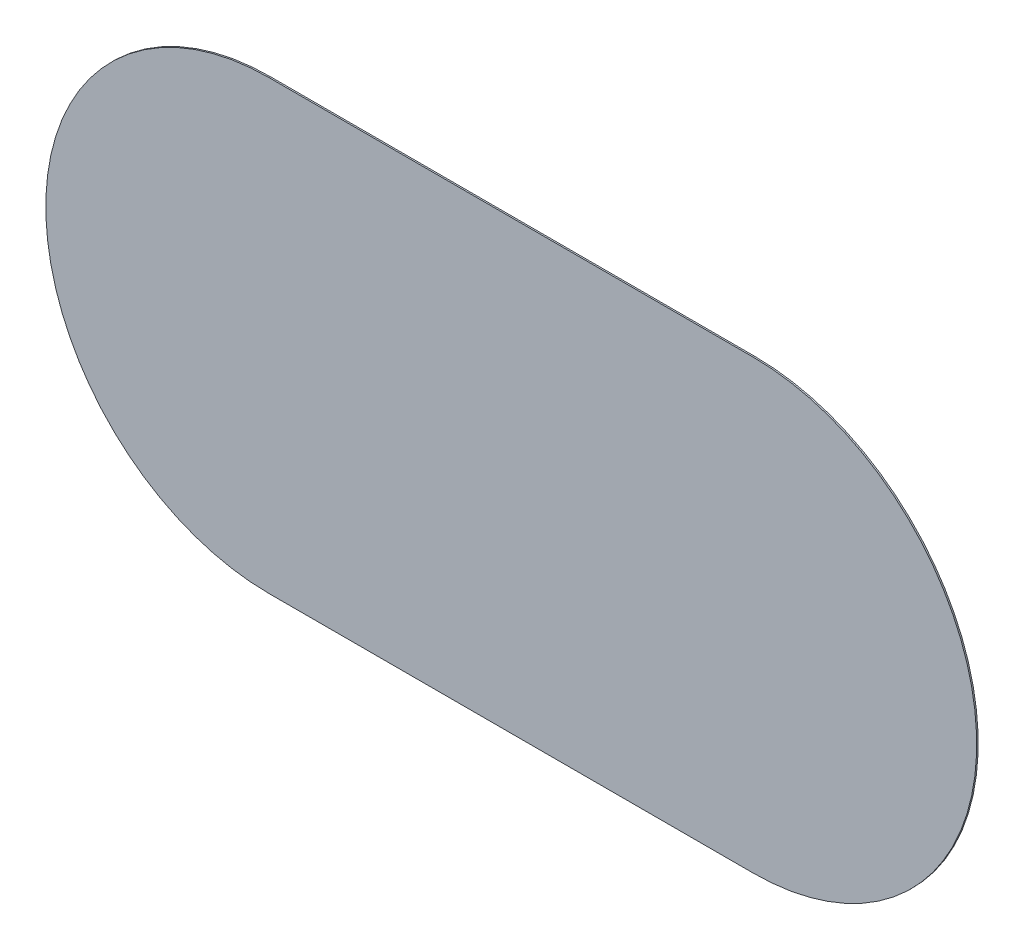
ISO-10303-21;
HEADER;
FILE_DESCRIPTION(('STEP AP214'),'2;1');
FILE_NAME('part.step','',(''),(''),'','','');
FILE_SCHEMA(('AUTOMOTIVE_DESIGN { 1 0 10303 214 1 1 1 1 }'));
ENDSEC;
DATA;
#1=APPLICATION_CONTEXT('core data for automotive mechanical design processes');
#2=APPLICATION_PROTOCOL_DEFINITION('international standard','automotive_design',2000,#1);
#3=PRODUCT_CONTEXT('',#1,'mechanical');
#4=PRODUCT('Part','Part','',(#3));
#5=PRODUCT_RELATED_PRODUCT_CATEGORY('part','',(#4));
#6=PRODUCT_DEFINITION_FORMATION('','',#4);
#7=PRODUCT_DEFINITION_CONTEXT('part definition',#1,'design');
#8=PRODUCT_DEFINITION('design','',#6,#7);
#9=PRODUCT_DEFINITION_SHAPE('','',#8);
#10=(LENGTH_UNIT() NAMED_UNIT(*) SI_UNIT(.MILLI.,.METRE.));
#11=(NAMED_UNIT(*) PLANE_ANGLE_UNIT() SI_UNIT($,.RADIAN.));
#12=(NAMED_UNIT(*) SI_UNIT($,.STERADIAN.) SOLID_ANGLE_UNIT());
#13=UNCERTAINTY_MEASURE_WITH_UNIT(LENGTH_MEASURE(1.E-05),#10,'distance_accuracy_value','');
#14=(GEOMETRIC_REPRESENTATION_CONTEXT(3) GLOBAL_UNCERTAINTY_ASSIGNED_CONTEXT((#13)) GLOBAL_UNIT_ASSIGNED_CONTEXT((#10,
#11,#12)) REPRESENTATION_CONTEXT('',''));
#15=CARTESIAN_POINT('',(0.,0.,0.));
#16=DIRECTION('',(0.,0.,1.));
#17=DIRECTION('',(1.,0.,0.));
#18=AXIS2_PLACEMENT_3D('',#15,#16,#17);
#19=CARTESIAN_POINT('',(-162.5,0.,-1.));
#20=DIRECTION('',(0.,0.,1.));
#21=DIRECTION('',(1.,0.,0.));
#22=AXIS2_PLACEMENT_3D('',#19,#20,#21);
#23=CYLINDRICAL_SURFACE('',#22,150.);
#24=CARTESIAN_POINT('',(-162.5,0.,0.));
#25=DIRECTION('',(0.,0.,1.));
#26=DIRECTION('',(1.,0.,0.));
#27=AXIS2_PLACEMENT_3D('',#24,#25,#26);
#28=CIRCLE('',#27,150.);
#29=CARTESIAN_POINT('',(-162.5,150.,0.));
#30=VERTEX_POINT('',#29);
#31=CARTESIAN_POINT('',(-162.5,-150.,0.));
#32=VERTEX_POINT('',#31);
#33=EDGE_CURVE('E102',#30,#32,#28,.T.);
#34=ORIENTED_EDGE('',*,*,#33,.F.);
#35=DIRECTION('',(0.,0.,1.));
#36=VECTOR('',#35,1.);
#37=CARTESIAN_POINT('',(-162.5,150.,-1.));
#38=LINE('',#37,#36);
#39=CARTESIAN_POINT('',(-162.5,150.,-1.));
#40=VERTEX_POINT('',#39);
#41=EDGE_CURVE('E11',#40,#30,#38,.T.);
#42=ORIENTED_EDGE('',*,*,#41,.F.);
#43=CARTESIAN_POINT('',(-162.5,0.,-1.));
#44=DIRECTION('',(0.,0.,1.));
#45=DIRECTION('',(1.,0.,0.));
#46=AXIS2_PLACEMENT_3D('',#43,#44,#45);
#47=CIRCLE('',#46,150.);
#48=CARTESIAN_POINT('',(-162.5,-150.,-1.));
#49=VERTEX_POINT('',#48);
#50=EDGE_CURVE('E96',#40,#49,#47,.T.);
#51=ORIENTED_EDGE('',*,*,#50,.T.);
#52=DIRECTION('',(0.,0.,1.));
#53=VECTOR('',#52,1.);
#54=CARTESIAN_POINT('',(-162.5,-150.,-1.));
#55=LINE('',#54,#53);
#56=EDGE_CURVE('E41',#49,#32,#55,.T.);
#57=ORIENTED_EDGE('',*,*,#56,.T.);
#58=EDGE_LOOP('',(#34,#42,#51,#57));
#59=FACE_BOUND('',#58,.T.);
#60=ADVANCED_FACE('F38',(#59),#23,.T.);
#61=CARTESIAN_POINT('',(-162.5,150.,-1.));
#62=DIRECTION('',(0.,1.,0.));
#63=DIRECTION('',(-1.,0.,0.));
#64=AXIS2_PLACEMENT_3D('',#61,#62,#63);
#65=PLANE('',#64);
#66=DIRECTION('',(-1.,0.,0.));
#67=VECTOR('',#66,1.);
#68=CARTESIAN_POINT('',(-162.5,150.,0.));
#69=LINE('',#68,#67);
#70=CARTESIAN_POINT('',(162.5,150.,0.));
#71=VERTEX_POINT('',#70);
#72=EDGE_CURVE('E98',#71,#30,#69,.T.);
#73=ORIENTED_EDGE('',*,*,#72,.F.);
#74=DIRECTION('',(0.,0.,1.));
#75=VECTOR('',#74,1.);
#76=CARTESIAN_POINT('',(162.5,150.,-1.));
#77=LINE('',#76,#75);
#78=CARTESIAN_POINT('',(162.5,150.,-1.));
#79=VERTEX_POINT('',#78);
#80=EDGE_CURVE('E47',#79,#71,#77,.T.);
#81=ORIENTED_EDGE('',*,*,#80,.F.);
#82=DIRECTION('',(-1.,0.,0.));
#83=VECTOR('',#82,1.);
#84=CARTESIAN_POINT('',(-162.5,150.,-1.));
#85=LINE('',#84,#83);
#86=EDGE_CURVE('E93',#79,#40,#85,.T.);
#87=ORIENTED_EDGE('',*,*,#86,.T.);
#88=ORIENTED_EDGE('',*,*,#41,.T.);
#89=EDGE_LOOP('',(#73,#81,#87,#88));
#90=FACE_BOUND('',#89,.T.);
#91=ADVANCED_FACE('F112',(#90),#65,.T.);
#92=CARTESIAN_POINT('',(162.5,0.,-1.));
#93=DIRECTION('',(0.,0.,1.));
#94=DIRECTION('',(1.,0.,0.));
#95=AXIS2_PLACEMENT_3D('',#92,#93,#94);
#96=CYLINDRICAL_SURFACE('',#95,150.);
#97=CARTESIAN_POINT('',(162.5,0.,0.));
#98=DIRECTION('',(0.,0.,1.));
#99=DIRECTION('',(1.,0.,0.));
#100=AXIS2_PLACEMENT_3D('',#97,#98,#99);
#101=CIRCLE('',#100,150.);
#102=CARTESIAN_POINT('',(162.5,-150.,0.));
#103=VERTEX_POINT('',#102);
#104=EDGE_CURVE('E88',#103,#71,#101,.T.);
#105=ORIENTED_EDGE('',*,*,#104,.F.);
#106=DIRECTION('',(0.,0.,1.));
#107=VECTOR('',#106,1.);
#108=CARTESIAN_POINT('',(162.5,-150.,-1.));
#109=LINE('',#108,#107);
#110=CARTESIAN_POINT('',(162.5,-150.,-1.));
#111=VERTEX_POINT('',#110);
#112=EDGE_CURVE('E83',#111,#103,#109,.T.);
#113=ORIENTED_EDGE('',*,*,#112,.F.);
#114=CARTESIAN_POINT('',(162.5,0.,-1.));
#115=DIRECTION('',(0.,0.,1.));
#116=DIRECTION('',(1.,0.,0.));
#117=AXIS2_PLACEMENT_3D('',#114,#115,#116);
#118=CIRCLE('',#117,150.);
#119=EDGE_CURVE('E86',#111,#79,#118,.T.);
#120=ORIENTED_EDGE('',*,*,#119,.T.);
#121=ORIENTED_EDGE('',*,*,#80,.T.);
#122=EDGE_LOOP('',(#105,#113,#120,#121));
#123=FACE_BOUND('',#122,.T.);
#124=ADVANCED_FACE('F85',(#123),#96,.T.);
#125=CARTESIAN_POINT('',(-162.5,-150.,-1.));
#126=DIRECTION('',(0.,-1.,0.));
#127=DIRECTION('',(1.,0.,0.));
#128=AXIS2_PLACEMENT_3D('',#125,#126,#127);
#129=PLANE('',#128);
#130=DIRECTION('',(1.,0.,0.));
#131=VECTOR('',#130,1.);
#132=CARTESIAN_POINT('',(-162.5,-150.,0.));
#133=LINE('',#132,#131);
#134=EDGE_CURVE('E105',#32,#103,#133,.T.);
#135=ORIENTED_EDGE('',*,*,#134,.F.);
#136=ORIENTED_EDGE('',*,*,#56,.F.);
#137=DIRECTION('',(1.,0.,0.));
#138=VECTOR('',#137,1.);
#139=CARTESIAN_POINT('',(-162.5,-150.,-1.));
#140=LINE('',#139,#138);
#141=EDGE_CURVE('E92',#49,#111,#140,.T.);
#142=ORIENTED_EDGE('',*,*,#141,.T.);
#143=ORIENTED_EDGE('',*,*,#112,.T.);
#144=EDGE_LOOP('',(#135,#136,#142,#143));
#145=FACE_BOUND('',#144,.T.);
#146=ADVANCED_FACE('F95',(#145),#129,.T.);
#147=CARTESIAN_POINT('',(-162.5,0.,-1.));
#148=DIRECTION('',(0.,0.,1.));
#149=DIRECTION('',(1.,0.,0.));
#150=AXIS2_PLACEMENT_3D('',#147,#148,#149);
#151=PLANE('',#150);
#152=ORIENTED_EDGE('',*,*,#50,.F.);
#153=ORIENTED_EDGE('',*,*,#86,.F.);
#154=ORIENTED_EDGE('',*,*,#119,.F.);
#155=ORIENTED_EDGE('',*,*,#141,.F.);
#156=EDGE_LOOP('',(#152,#153,#154,#155));
#157=FACE_BOUND('',#156,.T.);
#158=ADVANCED_FACE('F91',(#157),#151,.F.);
#159=CARTESIAN_POINT('',(-162.5,0.,0.));
#160=DIRECTION('',(0.,0.,1.));
#161=DIRECTION('',(1.,0.,0.));
#162=AXIS2_PLACEMENT_3D('',#159,#160,#161);
#163=PLANE('',#162);
#164=ORIENTED_EDGE('',*,*,#33,.T.);
#165=ORIENTED_EDGE('',*,*,#134,.T.);
#166=ORIENTED_EDGE('',*,*,#104,.T.);
#167=ORIENTED_EDGE('',*,*,#72,.T.);
#168=EDGE_LOOP('',(#164,#165,#166,#167));
#169=FACE_BOUND('',#168,.T.);
#170=ADVANCED_FACE('F111',(#169),#163,.T.);
#171=CLOSED_SHELL('',(#60,#91,#124,#146,#158,#170));
#172=MANIFOLD_SOLID_BREP('B2',#171);
#173=ADVANCED_BREP_SHAPE_REPRESENTATION('',(#18,#172),#14);
#174=SHAPE_DEFINITION_REPRESENTATION(#9,#173);
ENDSEC;
END-ISO-10303-21;
